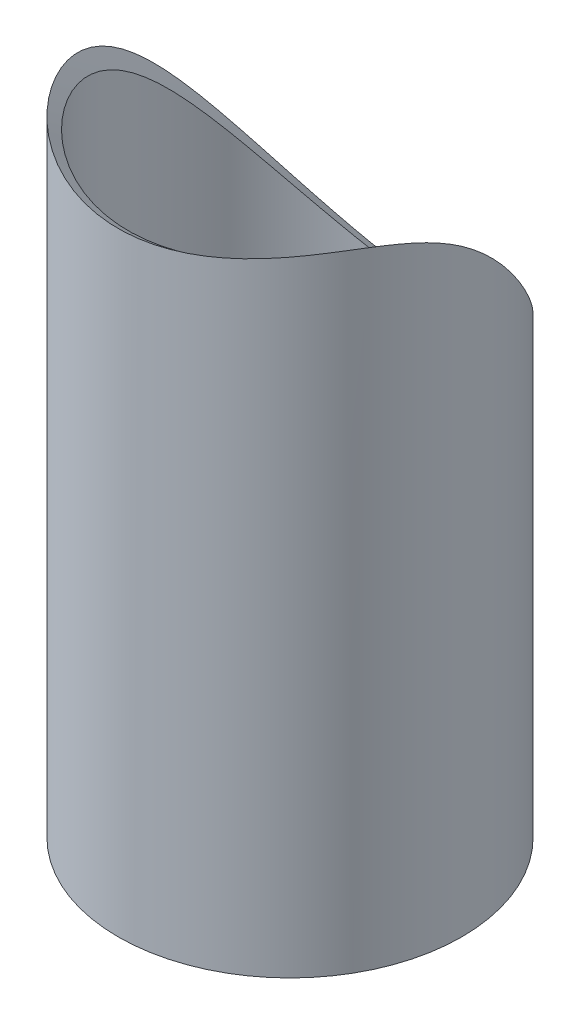
ISO-10303-21;
HEADER;
FILE_DESCRIPTION(('STEP AP214'),'2;1');
FILE_NAME('part.step','',(''),(''),'','','');
FILE_SCHEMA(('AUTOMOTIVE_DESIGN { 1 0 10303 214 1 1 1 1 }'));
ENDSEC;
DATA;
#1=APPLICATION_CONTEXT('core data for automotive mechanical design processes');
#2=APPLICATION_PROTOCOL_DEFINITION('international standard','automotive_design',2000,#1);
#3=PRODUCT_CONTEXT('',#1,'mechanical');
#4=PRODUCT('Part','Part','',(#3));
#5=PRODUCT_RELATED_PRODUCT_CATEGORY('part','',(#4));
#6=PRODUCT_DEFINITION_FORMATION('','',#4);
#7=PRODUCT_DEFINITION_CONTEXT('part definition',#1,'design');
#8=PRODUCT_DEFINITION('design','',#6,#7);
#9=PRODUCT_DEFINITION_SHAPE('','',#8);
#10=(LENGTH_UNIT() NAMED_UNIT(*) SI_UNIT(.MILLI.,.METRE.));
#11=(NAMED_UNIT(*) PLANE_ANGLE_UNIT() SI_UNIT($,.RADIAN.));
#12=(NAMED_UNIT(*) SI_UNIT($,.STERADIAN.) SOLID_ANGLE_UNIT());
#13=UNCERTAINTY_MEASURE_WITH_UNIT(LENGTH_MEASURE(1.E-05),#10,'distance_accuracy_value','');
#14=(GEOMETRIC_REPRESENTATION_CONTEXT(3) GLOBAL_UNCERTAINTY_ASSIGNED_CONTEXT((#13)) GLOBAL_UNIT_ASSIGNED_CONTEXT((#10,
#11,#12)) REPRESENTATION_CONTEXT('',''));
#15=CARTESIAN_POINT('',(0.,0.,0.));
#16=DIRECTION('',(0.,0.,1.));
#17=DIRECTION('',(1.,0.,0.));
#18=AXIS2_PLACEMENT_3D('',#15,#16,#17);
#19=CARTESIAN_POINT('',(0.,0.,0.));
#20=DIRECTION('',(0.,1.,0.));
#21=DIRECTION('',(0.,0.,1.));
#22=AXIS2_PLACEMENT_3D('',#19,#20,#21);
#23=PLANE('',#22);
#24=CARTESIAN_POINT('',(0.,0.,0.));
#25=DIRECTION('',(0.,1.,0.));
#26=DIRECTION('',(0.,0.,1.));
#27=AXIS2_PLACEMENT_3D('',#24,#25,#26);
#28=CIRCLE('',#27,50.);
#29=CARTESIAN_POINT('',(0.,0.,50.0000000000001));
#30=VERTEX_POINT('',#29);
#31=EDGE_CURVE('E57',#30,#30,#28,.T.);
#32=ORIENTED_EDGE('',*,*,#31,.F.);
#33=EDGE_LOOP('',(#32));
#34=FACE_BOUND('',#33,.T.);
#35=CARTESIAN_POINT('',(0.,0.,0.));
#36=DIRECTION('',(0.,1.,0.));
#37=DIRECTION('',(1.,0.,0.));
#38=AXIS2_PLACEMENT_3D('',#35,#36,#37);
#39=CIRCLE('',#38,47.);
#40=CARTESIAN_POINT('',(47.0000000000001,0.,0.));
#41=VERTEX_POINT('',#40);
#42=EDGE_CURVE('E91',#41,#41,#39,.T.);
#43=ORIENTED_EDGE('',*,*,#42,.T.);
#44=EDGE_LOOP('',(#43));
#45=FACE_BOUND('',#44,.T.);
#46=ADVANCED_FACE('F78',(#34,#45),#23,.F.);
#47=CARTESIAN_POINT('',(0.,200.,0.));
#48=DIRECTION('',(0.,-1.,0.));
#49=DIRECTION('',(0.,0.,-1.));
#50=AXIS2_PLACEMENT_3D('',#47,#48,#49);
#51=CYLINDRICAL_SURFACE('',#50,50.);
#52=CARTESIAN_POINT('',(0.,108.430637268986,-50.0000000000001));
#53=CARTESIAN_POINT('',(0.77174533367054,108.430646223002,-49.9999948704343));
#54=CARTESIAN_POINT('',(1.54360204241482,108.460675676616,-49.9820882374083));
#55=CARTESIAN_POINT('',(3.08135167827707,108.580013040187,-49.910903526332));
#56=CARTESIAN_POINT('',(3.84724153858137,108.669349629743,-49.8576083351662));
#57=CARTESIAN_POINT('',(5.36847248041861,108.905183512749,-49.7168392768921));
#58=CARTESIAN_POINT('',(6.12379020738744,109.051791392959,-49.6292992850653));
#59=CARTESIAN_POINT('',(7.61740166657286,109.398531592242,-49.4220997251477));
#60=CARTESIAN_POINT('',(8.35569548048029,109.598663654417,-49.3024403112199));
#61=CARTESIAN_POINT('',(9.98252571854039,110.100861709607,-49.0018817270175));
#62=CARTESIAN_POINT('',(10.8656507060097,110.415827712534,-48.8132007833047));
#63=CARTESIAN_POINT('',(12.5956227363142,111.111709873751,-48.3956910367889));
#64=CARTESIAN_POINT('',(13.4424596382285,111.492644319305,-48.1668511011844));
#65=CARTESIAN_POINT('',(15.0982665655558,112.31192888838,-47.6737819775416));
#66=CARTESIAN_POINT('',(15.9071917066264,112.750344844953,-47.4095122040895));
#67=CARTESIAN_POINT('',(17.4853690484224,113.675896295404,-46.850430964996));
#68=CARTESIAN_POINT('',(18.2546195452375,114.163033879097,-46.5556181892551));
#69=CARTESIAN_POINT('',(20.1791969507614,115.466697488355,-45.7647659024512));
#70=CARTESIAN_POINT('',(21.3062683996976,116.313443782347,-45.2493702750268));
#71=CARTESIAN_POINT('',(22.9284553185134,117.642008707567,-44.4370539202363));
#72=CARTESIAN_POINT('',(23.4579850262508,118.09480326822,-44.1596222172707));
#73=CARTESIAN_POINT('',(24.495207624722,119.017678728143,-43.5928211366362));
#74=CARTESIAN_POINT('',(25.0029012207733,119.487759068163,-43.3034521451401));
#75=CARTESIAN_POINT('',(25.9982888627901,120.444034095308,-42.7132823411099));
#76=CARTESIAN_POINT('',(26.4859395230467,120.93026000381,-42.4124591920726));
#77=CARTESIAN_POINT('',(27.4410187870677,121.916067465953,-41.8008602260611));
#78=CARTESIAN_POINT('',(27.9084474504623,122.415648980203,-41.4900844384398));
#79=CARTESIAN_POINT('',(29.2815869498122,123.931814176906,-40.5441136994022));
#80=CARTESIAN_POINT('',(30.1584241364122,124.966083421087,-39.8951121228435));
#81=CARTESIAN_POINT('',(31.7653880089697,126.975816284801,-38.6252732612539));
#82=CARTESIAN_POINT('',(32.5016148326146,127.948178640704,-38.0071693705916));
#83=CARTESIAN_POINT('',(33.9199842807094,129.916726388746,-36.7469018982997));
#84=CARTESIAN_POINT('',(34.6021177404196,130.912915780713,-36.1047342667072));
#85=CARTESIAN_POINT('',(35.9163961544436,132.924426092829,-34.7975872642466));
#86=CARTESIAN_POINT('',(36.5485028230844,133.939760943151,-34.132590969995));
#87=CARTESIAN_POINT('',(37.7653297662172,135.984322925071,-32.7811915108823));
#88=CARTESIAN_POINT('',(38.3500525577765,137.013549315347,-32.0947894857957));
#89=CARTESIAN_POINT('',(39.475897650627,139.084041813005,-30.6994895304231));
#90=CARTESIAN_POINT('',(40.016932447818,140.125327529599,-29.990550230999));
#91=CARTESIAN_POINT('',(41.0562778788561,142.214363100492,-28.551183321462));
#92=CARTESIAN_POINT('',(41.5545875414068,143.262113101167,-27.8207552233379));
#93=CARTESIAN_POINT('',(42.5098477783468,145.360047401741,-26.3379995128243));
#94=CARTESIAN_POINT('',(42.9668190181334,146.410230213134,-25.5856830939662));
#95=CARTESIAN_POINT('',(43.8407711489769,148.510027868721,-24.0574663768153));
#96=CARTESIAN_POINT('',(44.2577536733623,149.55964273437,-23.2815670434665));
#97=CARTESIAN_POINT('',(44.951187280731,151.388067645082,-21.9048854949969));
#98=CARTESIAN_POINT('',(45.2364017438668,152.167836445834,-21.3097721875365));
#99=CARTESIAN_POINT('',(45.7848868801791,153.723284395977,-20.1042956785731));
#100=CARTESIAN_POINT('',(46.0481580699664,154.498963641247,-19.49393283653));
#101=CARTESIAN_POINT('',(46.5526110299229,156.044562244769,-18.2565315599043));
#102=CARTESIAN_POINT('',(46.7937867949496,156.814479985245,-17.6294886513744));
#103=CARTESIAN_POINT('',(47.2534948450973,158.34618565325,-16.3574031765275));
#104=CARTESIAN_POINT('',(47.4720272071733,159.107973608402,-15.7123606713926));
#105=CARTESIAN_POINT('',(47.8851087809436,160.618834901337,-14.4043559416325));
#106=CARTESIAN_POINT('',(48.0797223081807,161.367937448734,-13.7414478880624));
#107=CARTESIAN_POINT('',(48.4445526930876,162.852665486856,-12.3940516382715));
#108=CARTESIAN_POINT('',(48.6147685072551,163.588290399964,-11.7095625205444));
#109=CARTESIAN_POINT('',(48.9291618943186,165.042120914902,-10.3172766064776));
#110=CARTESIAN_POINT('',(49.0733541703643,165.760336153258,-9.60949324023288));
#111=CARTESIAN_POINT('',(49.3337475795748,167.175465054219,-8.16808604391509));
#112=CARTESIAN_POINT('',(49.4499528394984,167.872381844088,-7.43446604182969));
#113=CARTESIAN_POINT('',(49.6633681889195,169.318630695793,-5.85301531355616));
#114=CARTESIAN_POINT('',(49.756860216457,170.064781330643,-5.00174866901594));
#115=CARTESIAN_POINT('',(49.901165408644,171.516125757948,-3.26129728977305));
#116=CARTESIAN_POINT('',(49.95197946131,172.221320402304,-2.37211334443445));
#117=CARTESIAN_POINT('',(50.0051583809036,173.579813904088,-0.55544480839764));
#118=CARTESIAN_POINT('',(50.0075992221804,174.233192535036,0.371977429281957));
#119=CARTESIAN_POINT('',(49.9575964510269,175.478170133414,2.26613825084415));
#120=CARTESIAN_POINT('',(49.9051639419592,176.069781572508,3.23286884283088));
#121=CARTESIAN_POINT('',(49.7512126645123,177.095036855861,5.05142911878288));
#122=CARTESIAN_POINT('',(49.6584439309061,177.538996281916,5.89817384718607));
#123=CARTESIAN_POINT('',(49.4245524389069,178.368695604263,7.61329648495907));
#124=CARTESIAN_POINT('',(49.283434856253,178.754441725919,8.48167206952506));
#125=CARTESIAN_POINT('',(48.9496942622812,179.46323687893,10.2333578328849));
#126=CARTESIAN_POINT('',(48.7571055374114,179.786327400702,11.1166577045809));
#127=CARTESIAN_POINT('',(48.3182748454514,180.368398818136,12.8910602943111));
#128=CARTESIAN_POINT('',(48.0720315124651,180.627378081346,13.7821632104346));
#129=CARTESIAN_POINT('',(47.5254751984526,181.082088793987,15.5626269900273));
#130=CARTESIAN_POINT('',(47.2252273398719,181.277895635275,16.4519886616072));
#131=CARTESIAN_POINT('',(46.5709665528923,181.61049605927,18.2218344797594));
#132=CARTESIAN_POINT('',(46.2169532127135,181.74728918997,19.1023185582848));
#133=CARTESIAN_POINT('',(45.4560397014596,181.967818643796,20.8484307845244));
#134=CARTESIAN_POINT('',(45.0490583511378,182.051472343245,21.7140337714464));
#135=CARTESIAN_POINT('',(44.1845839338777,182.172341603269,23.4230583431309));
#136=CARTESIAN_POINT('',(43.7270838787333,182.209550730427,24.2664768391026));
#137=CARTESIAN_POINT('',(42.9249989691221,182.238913418621,25.6486408077277));
#138=CARTESIAN_POINT('',(42.5937754128567,182.241968627887,26.1950075120176));
#139=CARTESIAN_POINT('',(41.9106652577393,182.232835870779,27.2746054184797));
#140=CARTESIAN_POINT('',(41.5587772737503,182.220646881473,27.8078357367111));
#141=CARTESIAN_POINT('',(40.8350037543272,182.183050943113,28.8601874150643));
#142=CARTESIAN_POINT('',(40.4631145392308,182.15764155437,29.3793061524252));
#143=CARTESIAN_POINT('',(39.7000393750529,182.095521574795,30.4025368646776));
#144=CARTESIAN_POINT('',(39.3088513843178,182.058809786098,30.9066472427217));
#145=CARTESIAN_POINT('',(38.5075843020106,181.975851636751,31.8994220280771));
#146=CARTESIAN_POINT('',(38.0974916876012,181.929598366063,32.3880749434735));
#147=CARTESIAN_POINT('',(37.25932729323,181.82923409463,33.3488996835633));
#148=CARTESIAN_POINT('',(36.8312538295492,181.775122356849,33.821069957215));
#149=CARTESIAN_POINT('',(35.5211786588426,181.603359466686,35.2117498648298));
#150=CARTESIAN_POINT('',(34.6130617342763,181.476251707162,36.1047510670881));
#151=CARTESIAN_POINT('',(32.7177208935566,181.2055939185,37.8314791422288));
#152=CARTESIAN_POINT('',(31.7294675386645,181.061814290487,38.6640356651591));
#153=CARTESIAN_POINT('',(29.6919834534551,180.768946003458,40.2498753900007));
#154=CARTESIAN_POINT('',(28.642752314308,180.61985730885,41.0031580603198));
#155=CARTESIAN_POINT('',(26.489229976758,180.324343877419,42.4262404082249));
#156=CARTESIAN_POINT('',(25.3849556249954,180.177918344004,43.0960654120431));
#157=CARTESIAN_POINT('',(23.1269410019157,179.894275157183,44.3487508189371));
#158=CARTESIAN_POINT('',(21.9731983263,179.757057952161,44.931606988903));
#159=CARTESIAN_POINT('',(19.5115005287043,179.485035656831,46.0575935016514));
#160=CARTESIAN_POINT('',(18.1992739516079,179.351683189378,46.5917684352795));
#161=CARTESIAN_POINT('',(15.5322024021887,179.108374845529,47.5474237378479));
#162=CARTESIAN_POINT('',(14.177354688762,178.998420477486,47.9688968419387));
#163=CARTESIAN_POINT('',(11.4347273248944,178.806357189408,48.6955808895048));
#164=CARTESIAN_POINT('',(10.0469446464292,178.724250840402,49.0007810985738));
#165=CARTESIAN_POINT('',(7.24901819503244,178.591082701877,49.4921103677659));
#166=CARTESIAN_POINT('',(5.83887539238348,178.540019569049,49.6782445801599));
#167=CARTESIAN_POINT('',(3.04945905603316,178.471886824735,49.925968750693));
#168=CARTESIAN_POINT('',(1.67052440638592,178.453845767611,49.9911187065495));
#169=CARTESIAN_POINT('',(-1.08805156141347,178.449405309312,50.0071849060002));
#170=CARTESIAN_POINT('',(-2.46769286765469,178.463005391293,49.9581030155187));
#171=CARTESIAN_POINT('',(-5.21729987708761,178.521366903251,49.7461641276362));
#172=CARTESIAN_POINT('',(-6.58726714173632,178.566123182638,49.5833259358525));
#173=CARTESIAN_POINT('',(-9.30780484092719,178.6852104177,49.145325866277));
#174=CARTESIAN_POINT('',(-10.6583753360588,178.759541280973,48.8701643394271));
#175=CARTESIAN_POINT('',(-13.3103428236409,178.933756575702,48.2148549835607));
#176=CARTESIAN_POINT('',(-14.6121744141633,179.03323812794,47.8363554813823));
#177=CARTESIAN_POINT('',(-17.1790967844387,179.254638817904,46.9756431030722));
#178=CARTESIAN_POINT('',(-18.4441879319128,179.376557730973,46.4934312653642));
#179=CARTESIAN_POINT('',(-20.9299493262394,179.638136179155,45.4286951006962));
#180=CARTESIAN_POINT('',(-22.1506045987431,179.777801624723,44.8461373305819));
#181=CARTESIAN_POINT('',(-24.5397820519339,180.068968725813,43.5846706177642));
#182=CARTESIAN_POINT('',(-25.7083034413601,180.220470560886,42.9057602133241));
#183=CARTESIAN_POINT('',(-27.4338128430975,180.453445886654,41.8075368786839));
#184=CARTESIAN_POINT('',(-28.0127147764089,180.53327347506,41.4218739216908));
#185=CARTESIAN_POINT('',(-29.1539120417143,180.692972940291,40.626750553474));
#186=CARTESIAN_POINT('',(-29.7162087973928,180.772844812717,40.2172921913925));
#187=CARTESIAN_POINT('',(-30.8234324233372,180.931393883584,39.3751185077731));
#188=CARTESIAN_POINT('',(-31.3683560893574,181.010070860257,38.9423989350814));
#189=CARTESIAN_POINT('',(-32.439840575892,181.164819395617,38.0544454050381));
#190=CARTESIAN_POINT('',(-32.9664031533979,181.240891203583,37.5992136120409));
#191=CARTESIAN_POINT('',(-34.0004583761415,181.388918710265,36.6667911067631));
#192=CARTESIAN_POINT('',(-34.5079482612213,181.460873814002,36.1895972382393));
#193=CARTESIAN_POINT('',(-35.5028990730288,181.598963749787,35.2140529173594));
#194=CARTESIAN_POINT('',(-35.9903619726989,181.665099155894,34.715704558903));
#195=CARTESIAN_POINT('',(-36.94442638886,181.789698683252,33.698596918791));
#196=CARTESIAN_POINT('',(-37.4110305267277,181.848163770248,33.1798402173991));
#197=CARTESIAN_POINT('',(-38.3225513771677,181.955389854833,32.1227215393654));
#198=CARTESIAN_POINT('',(-38.7674691404749,182.004151322928,31.5843605147927));
#199=CARTESIAN_POINT('',(-39.8940958692297,182.115368753067,30.1613455395055));
#200=CARTESIAN_POINT('',(-40.5583940543748,182.168590697797,29.2620353246076));
#201=CARTESIAN_POINT('',(-41.8258150448881,182.234609192138,27.4199026371023));
#202=CARTESIAN_POINT('',(-42.4289421467741,182.247408582843,26.4770832272593));
#203=CARTESIAN_POINT('',(-43.5693776272931,182.22150882907,24.5551516918157));
#204=CARTESIAN_POINT('',(-44.1067993458997,182.182899771291,23.576105968515));
#205=CARTESIAN_POINT('',(-45.1132898662897,182.042804621555,21.587769875433));
#206=CARTESIAN_POINT('',(-45.5823707717685,181.941329680402,20.5784848995299));
#207=CARTESIAN_POINT('',(-46.3851079720815,181.685130500663,18.6899426639737));
#208=CARTESIAN_POINT('',(-46.7285338684477,181.540470688542,17.8134694943269));
#209=CARTESIAN_POINT('',(-47.362171674964,181.192223427981,16.0530202918341));
#210=CARTESIAN_POINT('',(-47.6523900962066,180.988643197609,15.169045190883));
#211=CARTESIAN_POINT('',(-48.1791315933119,180.519330930844,13.4022594855316));
#212=CARTESIAN_POINT('',(-48.4156911952139,180.253641424462,12.5194484981348));
#213=CARTESIAN_POINT('',(-48.8362953615125,179.659306589468,10.7625426275881));
#214=CARTESIAN_POINT('',(-49.0203385478132,179.330659609151,9.88844797374633));
#215=CARTESIAN_POINT('',(-49.3376254005359,178.613571297734,8.15901537979993));
#216=CARTESIAN_POINT('',(-49.4710224794125,178.225315628014,7.30362831273583));
#217=CARTESIAN_POINT('',(-49.691066347962,177.392642929355,5.61458129479554));
#218=CARTESIAN_POINT('',(-49.7777126837508,176.948225355213,4.78092155493598));
#219=CARTESIAN_POINT('',(-49.9082130413267,176.008724948018,3.13843531368643));
#220=CARTESIAN_POINT('',(-49.9520309353528,175.513599728969,2.32963033442933));
#221=CARTESIAN_POINT('',(-50.0008636006181,174.479484470353,0.739388067173215));
#222=CARTESIAN_POINT('',(-50.0058740773407,173.940489582738,-0.0420461823940519));
#223=CARTESIAN_POINT('',(-49.9825686929427,172.894822469379,-1.48126861583114));
#224=CARTESIAN_POINT('',(-49.9583337596643,172.392510730161,-2.14231731680156));
#225=CARTESIAN_POINT('',(-49.8855262580292,171.363274583263,-3.44370244560015));
#226=CARTESIAN_POINT('',(-49.8369496094465,170.836346062681,-4.08403538183143));
#227=CARTESIAN_POINT('',(-49.7175109640014,169.76127903525,-5.34514168270077));
#228=CARTESIAN_POINT('',(-49.6466345392625,169.213126998783,-5.96590209709746));
#229=CARTESIAN_POINT('',(-49.4843944338813,168.099186883577,-7.18853041555995));
#230=CARTESIAN_POINT('',(-49.3930316144044,167.533399547015,-7.79039911254537));
#231=CARTESIAN_POINT('',(-49.1908046400509,166.384142737574,-8.97943207687246));
#232=CARTESIAN_POINT('',(-49.0798463844222,165.800599726261,-9.56650902352288));
#233=CARTESIAN_POINT('',(-48.8399693003777,164.620972871615,-10.7241217271015));
#234=CARTESIAN_POINT('',(-48.7110504751432,164.024889030503,-11.2946574869595));
#235=CARTESIAN_POINT('',(-48.4362751785691,162.822460846992,-12.4202559300744));
#236=CARTESIAN_POINT('',(-48.2904234438971,162.216119414312,-12.9753228868256));
#237=CARTESIAN_POINT('',(-47.9825153559099,160.99479876078,-14.0713267180891));
#238=CARTESIAN_POINT('',(-47.8204580865302,160.379819053315,-14.6122627916303));
#239=CARTESIAN_POINT('',(-47.4862510230138,159.162925241924,-15.6636605125458));
#240=CARTESIAN_POINT('',(-47.314600073452,158.561235640666,-16.1745412911306));
#241=CARTESIAN_POINT('',(-46.9570689273045,157.352505824954,-17.1849015071604));
#242=CARTESIAN_POINT('',(-46.7711881963955,156.745465410336,-17.6843805155578));
#243=CARTESIAN_POINT('',(-46.3854496018338,155.527083776101,-18.6727485534372));
#244=CARTESIAN_POINT('',(-46.1855899230698,154.915742007273,-19.1616361968376));
#245=CARTESIAN_POINT('',(-45.7720757365878,153.689820631137,-20.1294280089105));
#246=CARTESIAN_POINT('',(-45.5584208188143,153.075240928083,-20.608331880261));
#247=CARTESIAN_POINT('',(-44.8964676233845,151.226821674895,-22.0318912224374));
#248=CARTESIAN_POINT('',(-44.4275422831191,149.989445737101,-22.9624717183534));
#249=CARTESIAN_POINT('',(-43.434471686015,147.512020601554,-24.7896643736527));
#250=CARTESIAN_POINT('',(-42.9103303587408,146.27197160018,-25.6862789441279));
#251=CARTESIAN_POINT('',(-41.8071950860934,143.799239905566,-27.4450761669957));
#252=CARTESIAN_POINT('',(-41.2284004478261,142.566546641397,-28.3073687813675));
#253=CARTESIAN_POINT('',(-40.0118584416011,140.109701904582,-30.0023245430339));
#254=CARTESIAN_POINT('',(-39.3741067337331,138.885551067901,-30.8349855028438));
#255=CARTESIAN_POINT('',(-38.0369233938406,136.453120354571,-32.4700886689146));
#256=CARTESIAN_POINT('',(-37.3375606887929,135.244824436911,-33.2725632465771));
#257=CARTESIAN_POINT('',(-35.8721900498979,132.849489004497,-34.847422049782));
#258=CARTESIAN_POINT('',(-35.1061963986837,131.662444999764,-35.6198126728112));
#259=CARTESIAN_POINT('',(-33.6406521046493,129.519995754266,-37.001859997474));
#260=CARTESIAN_POINT('',(-32.9525223674562,128.560035141216,-37.6165579861275));
#261=CARTESIAN_POINT('',(-31.5230653061652,126.665109545202,-38.8222972784372));
#262=CARTESIAN_POINT('',(-30.7817403627651,125.7301434462,-39.4133396389352));
#263=CARTESIAN_POINT('',(-29.2405182152875,123.890284541124,-40.5699616014442));
#264=CARTESIAN_POINT('',(-28.4405379681218,122.985437116519,-41.1355031977694));
#265=CARTESIAN_POINT('',(-26.778224602356,121.215289844677,-42.2364840655153));
#266=CARTESIAN_POINT('',(-25.915891833243,120.349989775821,-42.7719235056293));
#267=CARTESIAN_POINT('',(-24.1113048326,118.657303141607,-43.8149104123748));
#268=CARTESIAN_POINT('',(-23.1680995667031,117.830618247382,-44.3219615596849));
#269=CARTESIAN_POINT('',(-21.2071004842991,116.241625749254,-45.2930015920104));
#270=CARTESIAN_POINT('',(-20.1892869290279,115.479335297536,-45.7569790070887));
#271=CARTESIAN_POINT('',(-18.0788956642935,114.038880283023,-46.6310408505829));
#272=CARTESIAN_POINT('',(-16.986569356873,113.360452633035,-47.0412940715481));
#273=CARTESIAN_POINT('',(-14.7238051395672,112.106370056419,-47.7977915183506));
#274=CARTESIAN_POINT('',(-13.5534467445446,111.530612642809,-48.1440995875978));
#275=CARTESIAN_POINT('',(-11.642689552833,110.719596811596,-48.6310181113026));
#276=CARTESIAN_POINT('',(-10.9263930019576,110.442438267335,-48.7972031158003));
#277=CARTESIAN_POINT('',(-9.47083202781187,109.936209986181,-49.1004639203233));
#278=CARTESIAN_POINT('',(-8.73156840555215,109.707138574335,-49.2375407342365));
#279=CARTESIAN_POINT('',(-7.23534191843745,109.302488652473,-49.4795184707285));
#280=CARTESIAN_POINT('',(-6.47842749899295,109.126778877861,-49.5844983531063));
#281=CARTESIAN_POINT('',(-4.94993654249593,108.83236797768,-49.7603177970591));
#282=CARTESIAN_POINT('',(-4.17836766816085,108.713637866986,-49.8311747167923));
#283=CARTESIAN_POINT('',(-2.83853802133395,108.560470177089,-49.922562680234));
#284=CARTESIAN_POINT('',(-2.27243083728956,108.51185605041,-49.9515598776125));
#285=CARTESIAN_POINT('',(-1.13756966405504,108.446932497848,-49.990282694027));
#286=CARTESIAN_POINT('',(-0.568815083895297,108.430630669426,-50.0000037807479));
#287=CARTESIAN_POINT('',(0.,108.430637268986,-50.0000000000001));
#288=B_SPLINE_CURVE_WITH_KNOTS('',3,(#52,#53,#54,#55,#56,#57,#58,#59,#60,#61,#62,#63,#64,#65,
#66,#67,#68,#69,#70,#71,#72,#73,#74,#75,#76,#77,#78,#79,#80,#81,#82,#83,#84,#85,#86,#87,#88,#89,
#90,#91,#92,#93,#94,#95,#96,#97,#98,#99,#100,#101,#102,#103,#104,#105,#106,#107,#108,#109,#110,
#111,#112,#113,#114,#115,#116,#117,#118,#119,#120,#121,#122,#123,#124,#125,#126,#127,#128,#129,
#130,#131,#132,#133,#134,#135,#136,#137,#138,#139,#140,#141,#142,#143,#144,#145,#146,#147,#148,
#149,#150,#151,#152,#153,#154,#155,#156,#157,#158,#159,#160,#161,#162,#163,#164,#165,#166,#167,
#168,#169,#170,#171,#172,#173,#174,#175,#176,#177,#178,#179,#180,#181,#182,#183,#184,#185,#186,
#187,#188,#189,#190,#191,#192,#193,#194,#195,#196,#197,#198,#199,#200,#201,#202,#203,#204,#205,
#206,#207,#208,#209,#210,#211,#212,#213,#214,#215,#216,#217,#218,#219,#220,#221,#222,#223,#224,
#225,#226,#227,#228,#229,#230,#231,#232,#233,#234,#235,#236,#237,#238,#239,#240,#241,#242,#243,
#244,#245,#246,#247,#248,#249,#250,#251,#252,#253,#254,#255,#256,#257,#258,#259,#260,#261,#262,
#263,#264,#265,#266,#267,#268,#269,#270,#271,#272,#273,#274,#275,#276,#277,#278,#279,#280,#281,
#282,#283,#284,#285,#286,#287),.UNSPECIFIED.,.T.,.F.,(4,2,2,2,2,2,2,2,2,2,2,2,2,2,2,2,2,2,2,2,2,
2,2,2,2,2,2,2,2,2,2,2,2,2,2,2,2,2,2,2,2,2,2,2,2,2,2,2,2,2,2,2,2,2,2,2,2,2,2,2,2,2,2,2,2,2,2,2,2,
2,2,2,2,2,2,2,2,2,2,2,2,2,2,2,2,2,2,2,2,2,2,2,2,2,2,2,2,2,2,2,2,2,2,2,2,2,2,2,2,2,2,2,2,2,2,2,2,
4),(0.,2.31464804750199,4.63041622299749,6.95067826135363,9.27092916339748,12.1358036307218,
15.001473551468,17.8704546449057,20.739558850282,25.2345904283045,27.483961029177,
29.7332589195832,31.987193640761,34.2411217151124,38.7477388097643,42.8481881241049,
46.9493306772155,51.0535820938522,55.1576153464478,59.2696746955056,63.3818275017477,
67.491913117695,71.6018307867371,74.6661293799287,77.7303558099112,80.7954125866564,
83.8604589462951,86.9170744735055,89.9738206946961,93.028834427993,96.0833974153521,
99.4890215136928,102.894574748176,106.294778839538,109.694295048711,112.573035832803,
115.451468544245,118.32798860515,121.204581902754,124.077729378516,126.950898860295,
129.828524815837,132.706549330582,134.622744889434,136.539069037853,138.455746949907,
140.372628067561,142.290902314328,144.20935658967,148.045022077896,151.941767746036,
155.838539543193,159.734125922993,163.629901854254,167.89373157929,172.157836087957,
176.422334166807,180.686647698126,184.823363110448,188.960010951913,193.095975105426,
197.23192633667,201.305413968239,205.378860815754,209.453667892097,213.528536792713,
215.628545063554,217.728372759309,219.828585527085,221.928596768726,224.028910758201,
226.129017338339,228.228859246173,230.328599312414,233.683326308244,237.03781751226,
240.386438131059,243.734464959975,246.588559593008,249.442304731986,252.294101432201,
255.145972960223,257.989135603076,260.832325848552,263.677912391236,266.52381382846,
269.014561028347,271.50572587393,273.998505820332,276.491180999956,278.996169155559,
281.501156867471,284.00544553624,286.509875847243,288.93295291103,291.35612100519,
293.779604324395,296.203159713412,301.054806875145,305.906108991925,310.740356770447,
315.574960688324,320.404222985768,325.23245264878,329.225638782367,333.218646316265,
337.217420496509,341.216172265281,345.270989111951,349.326882621445,353.369710748911,
357.408480393888,359.763949145715,362.119335839104,364.468880675005,366.817229044901,
368.522839959335,370.228851859745),.UNSPECIFIED.);
#289=CARTESIAN_POINT('',(0.,108.430637268986,-50.0000000000001));
#290=VERTEX_POINT('',#289);
#291=EDGE_CURVE('E97',#290,#290,#288,.T.);
#292=ORIENTED_EDGE('',*,*,#291,.T.);
#293=EDGE_LOOP('',(#292));
#294=FACE_BOUND('',#293,.T.);
#295=ORIENTED_EDGE('',*,*,#31,.T.);
#296=EDGE_LOOP('',(#295));
#297=FACE_BOUND('',#296,.T.);
#298=ADVANCED_FACE('F85',(#294,#297),#51,.T.);
#299=CARTESIAN_POINT('',(0.,200.,0.));
#300=DIRECTION('',(0.,-1.,0.));
#301=DIRECTION('',(0.,0.,-1.));
#302=AXIS2_PLACEMENT_3D('',#299,#300,#301);
#303=CYLINDRICAL_SURFACE('',#302,47.);
#304=CARTESIAN_POINT('',(0.,110.531259883615,-47.0000000000001));
#305=CARTESIAN_POINT('',(0.743480926324457,110.531268656047,-46.9999948319575));
#306=CARTESIAN_POINT('',(1.48706155166857,110.559880879825,-46.9823159213844));
#307=CARTESIAN_POINT('',(2.96825849327806,110.673571186755,-46.9120402636394));
#308=CARTESIAN_POINT('',(3.70587383698775,110.758658296708,-46.8594379343973));
#309=CARTESIAN_POINT('',(5.17028591563602,110.983165423739,-46.7205481125832));
#310=CARTESIAN_POINT('',(5.897071150825,111.122639439758,-46.6342271417509));
#311=CARTESIAN_POINT('',(7.3343809751013,111.452495846874,-46.4298834201981));
#312=CARTESIAN_POINT('',(8.04490426982658,111.64288227513,-46.3118581554453));
#313=CARTESIAN_POINT('',(9.61025815676885,112.120520027499,-46.0154023790758));
#314=CARTESIAN_POINT('',(10.4599080646738,112.420014707562,-45.8292984524148));
#315=CARTESIAN_POINT('',(12.1243644639102,113.081708732159,-45.4173487994396));
#316=CARTESIAN_POINT('',(12.9391620964695,113.443923902302,-45.1914930427239));
#317=CARTESIAN_POINT('',(14.5325392440862,114.223044791749,-44.7045893355701));
#318=CARTESIAN_POINT('',(15.3110672614103,114.640025245398,-44.443493281451));
#319=CARTESIAN_POINT('',(16.829923473871,115.520333906382,-43.890852895876));
#320=CARTESIAN_POINT('',(17.5702497177386,115.983664477641,-43.5993070114001));
#321=CARTESIAN_POINT('',(19.4154632135395,117.218978931602,-42.8197184051781));
#322=CARTESIAN_POINT('',(20.4936523482127,118.019101886892,-42.3126991514532));
#323=CARTESIAN_POINT('',(22.0455589405495,119.2741431798,-41.5130358024588));
#324=CARTESIAN_POINT('',(22.5521567766975,119.701817337352,-41.239840414128));
#325=CARTESIAN_POINT('',(23.5444274429926,120.5733584323,-40.6814933353006));
#326=CARTESIAN_POINT('',(24.0301009331979,121.017224858093,-40.396342022514));
#327=CARTESIAN_POINT('',(25.4588522337616,122.371890456666,-39.5233526856666));
#328=CARTESIAN_POINT('',(26.3716637527962,123.304120077751,-38.9190196708834));
#329=CARTESIAN_POINT('',(28.1226648689934,125.211925619574,-37.6732002219057));
#330=CARTESIAN_POINT('',(28.9608627770702,126.187496694487,-37.0317179387919));
#331=CARTESIAN_POINT('',(30.4763719579603,128.057886814709,-35.7915579304615));
#332=CARTESIAN_POINT('',(31.1610998436765,128.949089592883,-35.1964418844738));
#333=CARTESIAN_POINT('',(32.4807429891593,130.752121304261,-33.9824265717971));
#334=CARTESIAN_POINT('',(33.1156504008663,131.663953458114,-33.363523580812));
#335=CARTESIAN_POINT('',(34.3391199215165,133.503991420703,-32.1029102694647));
#336=CARTESIAN_POINT('',(34.9276482310982,134.432208578152,-31.4611838015495));
#337=CARTESIAN_POINT('',(36.0604633724846,136.300208444252,-30.1560865937102));
#338=CARTESIAN_POINT('',(36.6047523995304,137.239990576358,-29.4927169300564));
#339=CARTESIAN_POINT('',(37.6521126706954,139.1290208528,-28.1433654476207));
#340=CARTESIAN_POINT('',(38.1551151199498,140.0782819542,-27.4573484556537));
#341=CARTESIAN_POINT('',(39.120571695929,141.981329511187,-26.0633786240001));
#342=CARTESIAN_POINT('',(39.5830248449432,142.935116075306,-25.3554252559481));
#343=CARTESIAN_POINT('',(40.4682980787517,144.843358136097,-23.9171401160781));
#344=CARTESIAN_POINT('',(40.8911375707694,145.797813071967,-23.1868195374076));
#345=CARTESIAN_POINT('',(41.6980591339483,147.704413620142,-21.7022057100472));
#346=CARTESIAN_POINT('',(42.0821430730845,148.656559341587,-20.9479136190644));
#347=CARTESIAN_POINT('',(42.7150737024878,150.303656348458,-19.6166364705743));
#348=CARTESIAN_POINT('',(42.9728089783864,150.999983102847,-19.0455602384163));
#349=CARTESIAN_POINT('',(43.4671546299121,152.387812505292,-17.8886067536074));
#350=CARTESIAN_POINT('',(43.7037656007096,153.079315288756,-17.3027299185558));
#351=CARTESIAN_POINT('',(44.155515952095,154.455893459969,-16.1150295072928));
#352=CARTESIAN_POINT('',(44.3706507961067,155.140967462142,-15.5132025956515));
#353=CARTESIAN_POINT('',(44.778753162043,156.502560375354,-14.2925648648301));
#354=CARTESIAN_POINT('',(44.9717207128052,157.179079297521,-13.6737540677458));
#355=CARTESIAN_POINT('',(45.3340949195524,158.519522588105,-12.4195336880141));
#356=CARTESIAN_POINT('',(45.5035627330739,159.18347561172,-11.7841725050348));
#357=CARTESIAN_POINT('',(45.8183287698362,160.498065049517,-10.4938914219662));
#358=CARTESIAN_POINT('',(45.963626159768,161.148701003898,-9.83897084845754));
#359=CARTESIAN_POINT('',(46.2284069285855,162.433342164542,-8.50848224787489));
#360=CARTESIAN_POINT('',(46.3479024756093,163.067355085732,-7.83292412580061));
#361=CARTESIAN_POINT('',(46.5591692542616,164.315505943922,-6.4595921886492));
#362=CARTESIAN_POINT('',(46.6509439785739,164.929646376042,-5.7618211845394));
#363=CARTESIAN_POINT('',(46.8212560197042,166.266636281354,-4.18667349791198));
#364=CARTESIAN_POINT('',(46.8924463631374,166.983698887182,-3.30353869374157));
#365=CARTESIAN_POINT('',(46.984697173214,168.37405800421,-1.50082614641709));
#366=CARTESIAN_POINT('',(47.0057621972484,169.047358488844,-0.581251724080403));
#367=CARTESIAN_POINT('',(46.9915427342777,170.339955673035,1.29305739575814));
#368=CARTESIAN_POINT('',(46.9563356669611,170.959325335323,2.24774202341353));
#369=CARTESIAN_POINT('',(46.8228686623195,172.13529751373,4.19126686406073));
#370=CARTESIAN_POINT('',(46.7246102517804,172.691901549333,5.18010624944778));
#371=CARTESIAN_POINT('',(46.5241016496506,173.476196155641,6.69112145654969));
#372=CARTESIAN_POINT('',(46.4477077136899,173.7307444052,7.20299223052364));
#373=CARTESIAN_POINT('',(46.2762609333764,174.220356239154,8.23286337818638));
#374=CARTESIAN_POINT('',(46.1812105364721,174.455422373564,8.75086293950295));
#375=CARTESIAN_POINT('',(45.9717585034724,174.905298511856,9.79179860434821));
#376=CARTESIAN_POINT('',(45.8573546099627,175.120106148205,10.3147352770212));
#377=CARTESIAN_POINT('',(45.6086752653707,175.528864026613,11.3639496198636));
#378=CARTESIAN_POINT('',(45.4744024983826,175.722817079825,11.8902268295816));
#379=CARTESIAN_POINT('',(45.1855908477298,176.089621874996,12.9445392551891));
#380=CARTESIAN_POINT('',(45.0310530977855,176.262474796354,13.4725743711234));
#381=CARTESIAN_POINT('',(44.7015020704867,176.587115185173,14.5286495838483));
#382=CARTESIAN_POINT('',(44.526491329449,176.738905256942,15.0566896719354));
#383=CARTESIAN_POINT('',(44.155909649465,177.021797521999,16.1111103244261));
#384=CARTESIAN_POINT('',(43.9603383399582,177.152899342319,16.6374908587436));
#385=CARTESIAN_POINT('',(43.5487639606807,177.395044041654,17.6868010425565));
#386=CARTESIAN_POINT('',(43.3327615556554,177.506087572942,18.2097308037342));
#387=CARTESIAN_POINT('',(42.7235429415129,177.779415719655,19.6117816559228));
#388=CARTESIAN_POINT('',(42.3113624982713,177.923789482678,20.4862750841793));
#389=CARTESIAN_POINT('',(41.4308685296003,178.162999565358,22.2131247048281));
#390=CARTESIAN_POINT('',(40.9625622434103,178.257842265208,23.0654837349477));
#391=CARTESIAN_POINT('',(39.9718768472128,178.404675540851,24.7426386856314));
#392=CARTESIAN_POINT('',(39.449464807101,178.45663984523,25.5674174114087));
#393=CARTESIAN_POINT('',(38.3535376362066,178.524507876354,27.1838177481692));
#394=CARTESIAN_POINT('',(37.7800179052719,178.540408353615,27.9754363649976));
#395=CARTESIAN_POINT('',(36.5222667247607,178.54302714864,29.6021712675416));
#396=CARTESIAN_POINT('',(35.8327287632091,178.526522706565,30.4331899358567));
#397=CARTESIAN_POINT('',(34.3986666691966,178.466236484192,32.0452150985059));
#398=CARTESIAN_POINT('',(33.6541404010005,178.422453643913,32.8262196480994));
#399=CARTESIAN_POINT('',(32.1136964199681,178.315219626786,34.3347187011581));
#400=CARTESIAN_POINT('',(31.3177650715167,178.251763214257,35.0621988964756));
#401=CARTESIAN_POINT('',(29.67845975636,178.111904158741,36.4602490256844));
#402=CARTESIAN_POINT('',(28.8350825594106,178.035500633565,37.1308150768878));
#403=CARTESIAN_POINT('',(26.9502691162772,177.86134829469,38.5265132013901));
#404=CARTESIAN_POINT('',(25.9003390603352,177.762223035341,39.2400414010271));
#405=CARTESIAN_POINT('',(23.7462735223393,177.562324163015,40.5798424570806));
#406=CARTESIAN_POINT('',(22.6421325962573,177.461550385169,41.2061065258182));
#407=CARTESIAN_POINT('',(20.3860790523625,177.2651131917,42.3676513314607));
#408=CARTESIAN_POINT('',(19.2341514959068,177.169451395852,42.9029033462451));
#409=CARTESIAN_POINT('',(16.8900431037098,176.988840648335,43.8786762921144));
#410=CARTESIAN_POINT('',(15.6978624238438,176.903891655187,44.3191975899838));
#411=CARTESIAN_POINT('',(13.2291129610279,176.745837165436,45.1192339019196));
#412=CARTESIAN_POINT('',(11.9511153429896,176.673393196987,45.4744810091786));
#413=CARTESIAN_POINT('',(9.36867549855761,176.548792560817,46.0758686268374));
#414=CARTESIAN_POINT('',(8.06423228870876,176.496636649027,46.3220050718331));
#415=CARTESIAN_POINT('',(5.43862213193924,176.415215460991,46.7031147751338));
#416=CARTESIAN_POINT('',(4.11745692343731,176.385947824823,46.8380994939424));
#417=CARTESIAN_POINT('',(1.46815094637158,176.351709369056,46.99580154789));
#418=CARTESIAN_POINT('',(0.140010362283015,176.346737910111,47.0185218372276));
#419=CARTESIAN_POINT('',(-2.48458144846399,176.361166064523,46.9522385392925));
#420=CARTESIAN_POINT('',(-3.78109700773915,176.380041112241,46.8656397418728));
#421=CARTESIAN_POINT('',(-6.36197370858095,176.44040154595,46.5855138970436));
#422=CARTESIAN_POINT('',(-7.64633500539308,176.481886642748,46.3919882172832));
#423=CARTESIAN_POINT('',(-10.1937220080099,176.585516832675,45.8995735085537));
#424=CARTESIAN_POINT('',(-11.4567494703697,176.647660216072,45.6006931988774));
#425=CARTESIAN_POINT('',(-13.9528522882392,176.789567473063,44.8998711003052));
#426=CARTESIAN_POINT('',(-15.1859274071374,176.869331485802,44.4979284975484));
#427=CARTESIAN_POINT('',(-17.6153262089437,177.042424005034,43.593375066626));
#428=CARTESIAN_POINT('',(-18.811602893942,177.135769051026,43.0906412047359));
#429=CARTESIAN_POINT('',(-21.1579380539552,177.330576771734,41.9883561825073));
#430=CARTESIAN_POINT('',(-22.3079962643383,177.43203949292,41.3888044679204));
#431=CARTESIAN_POINT('',(-24.5555594442964,177.636539730096,40.0962073226314));
#432=CARTESIAN_POINT('',(-25.6530231196655,177.739578402341,39.4030900078909));
#433=CARTESIAN_POINT('',(-27.2534976605235,177.889123234841,38.2971003342779));
#434=CARTESIAN_POINT('',(-27.7794366332239,177.93814223495,37.9173293188511));
#435=CARTESIAN_POINT('',(-28.8152969274484,178.033333643369,37.1362257816641));
#436=CARTESIAN_POINT('',(-29.3252197171568,178.079506312974,36.7348952454344));
#437=CARTESIAN_POINT('',(-30.3398244390739,178.168765159253,35.9017534483468));
#438=CARTESIAN_POINT('',(-30.8441119555666,178.211755172911,35.4694517188518));
#439=CARTESIAN_POINT('',(-31.8341209806959,178.291951399335,34.5836646714697));
#440=CARTESIAN_POINT('',(-32.3198443588552,178.329158195669,34.1301814969592));
#441=CARTESIAN_POINT('',(-33.2720013849155,178.396193916214,33.2026468407125));
#442=CARTESIAN_POINT('',(-33.7384304718144,178.426021104157,32.7285905493295));
#443=CARTESIAN_POINT('',(-34.6509344672581,178.476544024316,31.760902883618));
#444=CARTESIAN_POINT('',(-35.0970117488729,178.49724082361,31.2672738041343));
#445=CARTESIAN_POINT('',(-35.9674833006894,178.527623258108,30.2618863067158));
#446=CARTESIAN_POINT('',(-36.3919014281177,178.537321269738,29.7501489354659));
#447=CARTESIAN_POINT('',(-37.2186391336757,178.543767290519,28.7091387629539));
#448=CARTESIAN_POINT('',(-37.6209615262617,178.540516952868,28.1798682088233));
#449=CARTESIAN_POINT('',(-38.4025809349307,178.518990404482,27.1050392407391));
#450=CARTESIAN_POINT('',(-38.7818831734424,178.500717615575,26.5594845632689));
#451=CARTESIAN_POINT('',(-39.5166204271914,178.447011255505,25.4534401178281));
#452=CARTESIAN_POINT('',(-39.8720573137319,178.411579031621,24.8929515256641));
#453=CARTESIAN_POINT('',(-40.7304214350949,178.298740083702,23.4738815170975));
#454=CARTESIAN_POINT('',(-41.217898154017,178.209193701186,22.6068006983047));
#455=CARTESIAN_POINT('',(-42.1343644463145,177.979402841827,20.8489275707857));
#456=CARTESIAN_POINT('',(-42.5633640489138,177.839167073661,19.9581393594412));
#457=CARTESIAN_POINT('',(-43.3603320472288,177.502069091315,18.1616514579975));
#458=CARTESIAN_POINT('',(-43.7283909328761,177.305292044842,17.2559761124238));
#459=CARTESIAN_POINT('',(-44.4031286514817,176.850607608001,15.4370698721992));
#460=CARTESIAN_POINT('',(-44.7098068205171,176.592699556477,14.5238388959342));
#461=CARTESIAN_POINT('',(-45.2623830800812,176.013337946495,12.6975689794957));
#462=CARTESIAN_POINT('',(-45.5081924712205,175.691792867219,11.7845322343198));
#463=CARTESIAN_POINT('',(-45.9401477529347,174.986164464155,9.96865305520637));
#464=CARTESIAN_POINT('',(-46.1262945296987,174.602082069381,9.06581047004369));
#465=CARTESIAN_POINT('',(-46.4421405020311,173.774390989827,7.27691992850654));
#466=CARTESIAN_POINT('',(-46.5717925186235,173.330732956095,6.3908865978724));
#467=CARTESIAN_POINT('',(-46.7785295676593,172.389324149402,4.64167278343155));
#468=CARTESIAN_POINT('',(-46.855607155829,171.891565727662,3.77849555255809));
#469=CARTESIAN_POINT('',(-46.9460974865062,171.002187350197,2.32912685972271));
#470=CARTESIAN_POINT('',(-46.9715771353488,170.622506647533,1.73625923509548));
#471=CARTESIAN_POINT('',(-47.0002699923256,169.841727624697,0.564164076475065));
#472=CARTESIAN_POINT('',(-47.0034809925995,169.440627184804,-0.0150620993413055));
#473=CARTESIAN_POINT('',(-46.9891778118094,168.619220612516,-1.15971067860273));
#474=CARTESIAN_POINT('',(-46.9716566641256,168.19890806992,-1.72512837680998));
#475=CARTESIAN_POINT('',(-46.9173249833538,167.341367999576,-2.84205075265828));
#476=CARTESIAN_POINT('',(-46.8805134097931,166.904139560609,-3.39355467814666));
#477=CARTESIAN_POINT('',(-46.7887684600698,166.013421043165,-4.48462005075078));
#478=CARTESIAN_POINT('',(-46.7337779707544,165.55988378109,-5.02413806630561));
#479=CARTESIAN_POINT('',(-46.6068843267294,164.639752310366,-6.08985140046152));
#480=CARTESIAN_POINT('',(-46.5349812420451,164.173158155785,-6.6160467742141));
#481=CARTESIAN_POINT('',(-46.3752990499061,163.228669804514,-7.65559700195391));
#482=CARTESIAN_POINT('',(-46.2875218272618,162.750776955221,-8.16895337214752));
#483=CARTESIAN_POINT('',(-46.0969603339016,161.785150993531,-9.18349474922809));
#484=CARTESIAN_POINT('',(-45.9941752313631,161.297417336994,-9.68467907967392));
#485=CARTESIAN_POINT('',(-45.6837389723481,159.907882494087,-11.0839428613803));
#486=CARTESIAN_POINT('',(-45.4594929535324,158.996207021865,-11.9685979145556));
#487=CARTESIAN_POINT('',(-44.9670649366185,157.151801630346,-13.7031302730628));
#488=CARTESIAN_POINT('',(-44.6988751891027,156.219068022533,-14.5530014112007));
#489=CARTESIAN_POINT('',(-44.1206579909848,154.337723883652,-16.2218345110556));
#490=CARTESIAN_POINT('',(-43.8105980602488,153.389101532613,-17.0407718388547));
#491=CARTESIAN_POINT('',(-43.1502019074215,151.481659695354,-18.649832933313));
#492=CARTESIAN_POINT('',(-42.7998680321229,150.522840806246,-19.4399583753316));
#493=CARTESIAN_POINT('',(-42.0591013993375,148.598148138629,-20.9946222181897));
#494=CARTESIAN_POINT('',(-41.6686262299846,147.632267920949,-21.7591324006342));
#495=CARTESIAN_POINT('',(-40.8477946608864,145.698245224634,-23.2635317071515));
#496=CARTESIAN_POINT('',(-40.4174371992729,144.730102686434,-24.0034201749564));
#497=CARTESIAN_POINT('',(-39.5164348474057,142.795707377129,-25.4594558018682));
#498=CARTESIAN_POINT('',(-39.045813288401,141.82945383905,-26.1756163808987));
#499=CARTESIAN_POINT('',(-38.0628669061133,139.90180514331,-27.5854423759326));
#500=CARTESIAN_POINT('',(-37.5505444577251,138.940409712283,-28.2791090698365));
#501=CARTESIAN_POINT('',(-36.6317282130595,137.293639473482,-29.453457728946));
#502=CARTESIAN_POINT('',(-36.2356805964028,136.606225015897,-29.9394770611614));
#503=CARTESIAN_POINT('',(-35.4201965456004,135.237221821994,-30.8999449529186));
#504=CARTESIAN_POINT('',(-35.0007608450525,134.555632903723,-31.3743938747113));
#505=CARTESIAN_POINT('',(-34.1374422644343,133.199675953635,-32.3116239851518));
#506=CARTESIAN_POINT('',(-33.6935543606437,132.525309439915,-32.7744027474737));
#507=CARTESIAN_POINT('',(-32.7802972925967,131.185644190583,-33.6878199537229));
#508=CARTESIAN_POINT('',(-32.3109281596844,130.520345443819,-34.1384584125829));
#509=CARTESIAN_POINT('',(-31.3467636533983,129.202524256899,-35.0258262737704));
#510=CARTESIAN_POINT('',(-30.8520409815077,128.549971964586,-35.4625902031959));
#511=CARTESIAN_POINT('',(-29.8345896445684,127.257926554612,-36.3227346428805));
#512=CARTESIAN_POINT('',(-29.3118600609524,126.61843386623,-36.7461147134523));
#513=CARTESIAN_POINT('',(-28.2371263473111,125.355315319058,-37.5782700029398));
#514=CARTESIAN_POINT('',(-27.6851361211593,124.731682129063,-37.9870520066262));
#515=CARTESIAN_POINT('',(-26.5500820128807,123.502961499621,-38.7888629274662));
#516=CARTESIAN_POINT('',(-25.9670218804006,122.897871836084,-39.1818937355545));
#517=CARTESIAN_POINT('',(-24.6668577579353,121.609293504526,-40.0154844568038));
#518=CARTESIAN_POINT('',(-23.9437330056296,120.92979703203,-40.452878724705));
#519=CARTESIAN_POINT('',(-22.4497517741663,119.607187665208,-41.3006812588725));
#520=CARTESIAN_POINT('',(-21.6788953345861,118.964074740715,-41.7110895475139));
#521=CARTESIAN_POINT('',(-20.0872182668629,117.722502484707,-42.5004996476742));
#522=CARTESIAN_POINT('',(-19.2664211978039,117.124022390078,-42.879516071824));
#523=CARTESIAN_POINT('',(-17.5726809418771,115.981148209898,-43.6010051672802));
#524=CARTESIAN_POINT('',(-16.6997516515923,115.436739812906,-43.943487510041));
#525=CARTESIAN_POINT('',(-15.106283697691,114.530176750351,-44.5122842720239));
#526=CARTESIAN_POINT('',(-14.3963832171067,114.15477007384,-44.7472805793926));
#527=CARTESIAN_POINT('',(-12.9456838375944,113.448967726094,-45.1883150942992));
#528=CARTESIAN_POINT('',(-12.204885229107,113.118571631886,-45.3943535739596));
#529=CARTESIAN_POINT('',(-10.6955819456025,112.509778942164,-45.7734510792912));
#530=CARTESIAN_POINT('',(-9.92713011032168,112.231288867341,-45.9465694036078));
#531=CARTESIAN_POINT('',(-8.36459335523991,111.732092614448,-46.2565371227211));
#532=CARTESIAN_POINT('',(-7.57051696320573,111.51136743071,-46.3933984468924));
#533=CARTESIAN_POINT('',(-6.21590864820471,111.193283461294,-46.5904714751527));
#534=CARTESIAN_POINT('',(-5.66083202889167,111.078979350362,-46.6612394248658));
#535=CARTESIAN_POINT('',(-4.54288478362419,110.881727438534,-46.783311851157));
#536=CARTESIAN_POINT('',(-3.98001315531053,110.798783709814,-46.8346138000589));
#537=CARTESIAN_POINT('',(-2.8489255159246,110.665546601622,-46.9170027013335));
#538=CARTESIAN_POINT('',(-2.28070943507887,110.615253649018,-46.9480893894171));
#539=CARTESIAN_POINT('',(-1.14168148289864,110.548110133423,-46.9895880375656));
#540=CARTESIAN_POINT('',(-0.570870131197897,110.531253147841,-47.0000039682004));
#541=CARTESIAN_POINT('',(0.,110.531259883615,-47.0000000000001));
#542=B_SPLINE_CURVE_WITH_KNOTS('',3,(#304,#305,#306,#307,#308,#309,#310,#311,#312,#313,#314,
#315,#316,#317,#318,#319,#320,#321,#322,#323,#324,#325,#326,#327,#328,#329,#330,#331,#332,#333,
#334,#335,#336,#337,#338,#339,#340,#341,#342,#343,#344,#345,#346,#347,#348,#349,#350,#351,#352,
#353,#354,#355,#356,#357,#358,#359,#360,#361,#362,#363,#364,#365,#366,#367,#368,#369,#370,#371,
#372,#373,#374,#375,#376,#377,#378,#379,#380,#381,#382,#383,#384,#385,#386,#387,#388,#389,#390,
#391,#392,#393,#394,#395,#396,#397,#398,#399,#400,#401,#402,#403,#404,#405,#406,#407,#408,#409,
#410,#411,#412,#413,#414,#415,#416,#417,#418,#419,#420,#421,#422,#423,#424,#425,#426,#427,#428,
#429,#430,#431,#432,#433,#434,#435,#436,#437,#438,#439,#440,#441,#442,#443,#444,#445,#446,#447,
#448,#449,#450,#451,#452,#453,#454,#455,#456,#457,#458,#459,#460,#461,#462,#463,#464,#465,#466,
#467,#468,#469,#470,#471,#472,#473,#474,#475,#476,#477,#478,#479,#480,#481,#482,#483,#484,#485,
#486,#487,#488,#489,#490,#491,#492,#493,#494,#495,#496,#497,#498,#499,#500,#501,#502,#503,#504,
#505,#506,#507,#508,#509,#510,#511,#512,#513,#514,#515,#516,#517,#518,#519,#520,#521,#522,#523,
#524,#525,#526,#527,#528,#529,#530,#531,#532,#533,#534,#535,#536,#537,#538,#539,#540,#541),
.UNSPECIFIED.,.T.,.F.,(4,2,2,2,2,2,2,2,2,2,2,2,2,2,2,2,2,2,2,2,2,2,2,2,2,2,2,2,2,2,2,2,2,2,2,2,
2,2,2,2,2,2,2,2,2,2,2,2,2,2,2,2,2,2,2,2,2,2,2,2,2,2,2,2,2,2,2,2,2,2,2,2,2,2,2,2,2,2,2,2,2,2,2,2,
2,2,2,2,2,2,2,2,2,2,2,2,2,2,2,2,2,2,2,2,2,2,2,2,2,2,2,2,2,2,2,2,2,2,4),(0.,2.22986523808593,
4.46008697797769,6.6925286917584,8.92514748211953,11.6807108045806,14.436970425434,
17.1970311788691,19.9572327713405,24.2553051474299,26.4060833721548,28.5567937008745,
32.8665413017097,37.1758082545872,40.9894848144463,44.803760929534,48.6207915238369,
52.437632593723,56.2607096521992,60.0838788660381,63.9051651582787,67.7262671806524,
70.5360663743728,73.3457863779151,76.1560986509938,78.9664072680836,81.7692590556317,
84.5722074553816,87.3738310846926,90.175101576159,93.5922777882883,97.0091432990886,
100.421311898325,103.833397875145,105.56309888112,107.292573127691,109.022249241411,
110.75169190544,112.481037857381,114.210169794016,115.939332899917,117.668439765174,
120.597372038251,123.525926936706,126.45627481895,129.386886725807,132.623710339987,
135.860659737948,139.098471317831,142.336503604263,146.152141962463,149.968164286095,
153.785388666357,157.60259826657,161.582987400257,165.563524828622,169.543651784935,
173.523674005063,177.417650313458,181.311576817068,185.205181129646,189.098816190133,
192.997233387048,196.89567290183,200.797124716205,202.748375260055,204.699446409954,
206.695672058246,208.691696141781,210.68818940259,212.684449269346,214.678460601594,
216.672217353654,218.66552009153,220.658666349818,223.651601882052,226.644023457863,
229.631960990737,232.619930840809,235.612229539868,238.604483791243,241.599232117999,
244.594404398028,246.707077142656,248.819959348576,250.933551747599,253.047258159732,
255.167669387741,257.288071836487,259.408222685076,261.528491089201,265.396719344987,
269.26563049327,273.137560316271,277.009264633309,280.885102539261,284.761043669284,
288.634753881627,292.508243637619,295.299038730719,298.089746336072,300.88102944804,
303.672309126556,306.45598958838,309.239761404977,312.022222102525,314.804347758221,
318.055761445878,321.307172437616,324.557061319476,327.806087730968,330.314271457018,
332.822431611588,335.326030142628,337.828803907059,339.54105517467,341.25352870349,
342.966024620297,344.678191558207),.UNSPECIFIED.);
#543=CARTESIAN_POINT('',(0.,110.531259883615,-47.0000000000001));
#544=VERTEX_POINT('',#543);
#545=EDGE_CURVE('E83',#544,#544,#542,.T.);
#546=ORIENTED_EDGE('',*,*,#545,.F.);
#547=EDGE_LOOP('',(#546));
#548=FACE_BOUND('',#547,.T.);
#549=ORIENTED_EDGE('',*,*,#42,.F.);
#550=EDGE_LOOP('',(#549));
#551=FACE_BOUND('',#550,.T.);
#552=ADVANCED_FACE('F106',(#548,#551),#303,.F.);
#553=CARTESIAN_POINT('',(0.,236.737669159099,24.2760071185446));
#554=DIRECTION('',(0.,-0.573576436351044,-0.819152044288995));
#555=DIRECTION('',(0.,0.819152044288993,-0.573576436351045));
#556=AXIS2_PLACEMENT_3D('',#553,#554,#555);
#557=CYLINDRICAL_SURFACE('',#556,62.5);
#558=ORIENTED_EDGE('',*,*,#545,.T.);
#559=EDGE_LOOP('',(#558));
#560=FACE_BOUND('',#559,.T.);
#561=ORIENTED_EDGE('',*,*,#291,.F.);
#562=EDGE_LOOP('',(#561));
#563=FACE_BOUND('',#562,.T.);
#564=ADVANCED_FACE('F103',(#560,#563),#557,.F.);
#565=CLOSED_SHELL('',(#46,#298,#552,#564));
#566=MANIFOLD_SOLID_BREP('B7',#565);
#567=ADVANCED_BREP_SHAPE_REPRESENTATION('',(#18,#566),#14);
#568=SHAPE_DEFINITION_REPRESENTATION(#9,#567);
ENDSEC;
END-ISO-10303-21;
